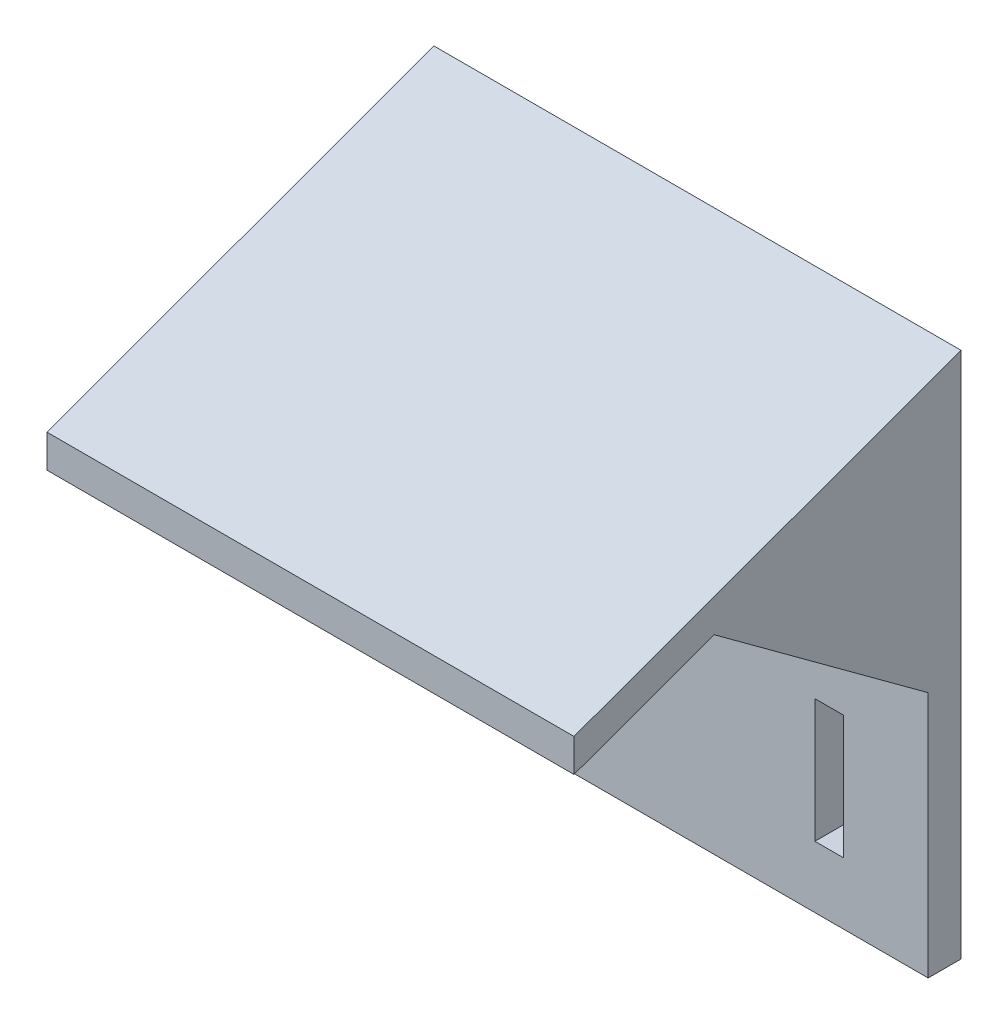
ISO-10303-21;
HEADER;
FILE_DESCRIPTION(('STEP AP214'),'2;1');
FILE_NAME('part.step','',(''),(''),'','','');
FILE_SCHEMA(('AUTOMOTIVE_DESIGN { 1 0 10303 214 1 1 1 1 }'));
ENDSEC;
DATA;
#1=APPLICATION_CONTEXT('core data for automotive mechanical design processes');
#2=APPLICATION_PROTOCOL_DEFINITION('international standard','automotive_design',2000,#1);
#3=PRODUCT_CONTEXT('',#1,'mechanical');
#4=PRODUCT('Part','Part','',(#3));
#5=PRODUCT_RELATED_PRODUCT_CATEGORY('part','',(#4));
#6=PRODUCT_DEFINITION_FORMATION('','',#4);
#7=PRODUCT_DEFINITION_CONTEXT('part definition',#1,'design');
#8=PRODUCT_DEFINITION('design','',#6,#7);
#9=PRODUCT_DEFINITION_SHAPE('','',#8);
#10=(LENGTH_UNIT() NAMED_UNIT(*) SI_UNIT(.MILLI.,.METRE.));
#11=(NAMED_UNIT(*) PLANE_ANGLE_UNIT() SI_UNIT($,.RADIAN.));
#12=(NAMED_UNIT(*) SI_UNIT($,.STERADIAN.) SOLID_ANGLE_UNIT());
#13=UNCERTAINTY_MEASURE_WITH_UNIT(LENGTH_MEASURE(1.E-05),#10,'distance_accuracy_value','');
#14=(GEOMETRIC_REPRESENTATION_CONTEXT(3) GLOBAL_UNCERTAINTY_ASSIGNED_CONTEXT((#13)) GLOBAL_UNIT_ASSIGNED_CONTEXT((#10,
#11,#12)) REPRESENTATION_CONTEXT('',''));
#15=CARTESIAN_POINT('',(0.,0.,0.));
#16=DIRECTION('',(0.,0.,1.));
#17=DIRECTION('',(1.,0.,0.));
#18=AXIS2_PLACEMENT_3D('',#15,#16,#17);
#19=CARTESIAN_POINT('',(32.,64.,0.));
#20=DIRECTION('',(0.,0.,1.));
#21=DIRECTION('',(1.,0.,0.));
#22=AXIS2_PLACEMENT_3D('',#19,#20,#21);
#23=PLANE('',#22);
#24=DIRECTION('',(1.,0.,0.));
#25=VECTOR('',#24,1.);
#26=CARTESIAN_POINT('',(-18.25,22.5,0.));
#27=LINE('',#26,#25);
#28=CARTESIAN_POINT('',(-21.75,22.5,0.));
#29=VERTEX_POINT('',#28);
#30=CARTESIAN_POINT('',(-18.25,22.5,0.));
#31=VERTEX_POINT('',#30);
#32=EDGE_CURVE('E159',#29,#31,#27,.T.);
#33=ORIENTED_EDGE('',*,*,#32,.F.);
#34=DIRECTION('',(0.,1.,0.));
#35=VECTOR('',#34,1.);
#36=CARTESIAN_POINT('',(-21.75,7.5,0.));
#37=LINE('',#36,#35);
#38=CARTESIAN_POINT('',(-21.75,7.5,0.));
#39=VERTEX_POINT('',#38);
#40=EDGE_CURVE('E50',#39,#29,#37,.T.);
#41=ORIENTED_EDGE('',*,*,#40,.F.);
#42=DIRECTION('',(-1.,0.,0.));
#43=VECTOR('',#42,1.);
#44=CARTESIAN_POINT('',(-18.25,7.5,0.));
#45=LINE('',#44,#43);
#46=CARTESIAN_POINT('',(-18.25,7.5,0.));
#47=VERTEX_POINT('',#46);
#48=EDGE_CURVE('E165',#47,#39,#45,.T.);
#49=ORIENTED_EDGE('',*,*,#48,.F.);
#50=DIRECTION('',(0.,-1.,0.));
#51=VECTOR('',#50,1.);
#52=CARTESIAN_POINT('',(-18.25,7.5,0.));
#53=LINE('',#52,#51);
#54=EDGE_CURVE('E149',#31,#47,#53,.T.);
#55=ORIENTED_EDGE('',*,*,#54,.F.);
#56=EDGE_LOOP('',(#33,#41,#49,#55));
#57=FACE_BOUND('',#56,.T.);
#58=DIRECTION('',(1.,0.,0.));
#59=VECTOR('',#58,1.);
#60=CARTESIAN_POINT('',(21.75,22.5,0.));
#61=LINE('',#60,#59);
#62=CARTESIAN_POINT('',(18.25,22.5,0.));
#63=VERTEX_POINT('',#62);
#64=CARTESIAN_POINT('',(21.75,22.5,0.));
#65=VERTEX_POINT('',#64);
#66=EDGE_CURVE('E189',#63,#65,#61,.T.);
#67=ORIENTED_EDGE('',*,*,#66,.F.);
#68=DIRECTION('',(0.,1.,0.));
#69=VECTOR('',#68,1.);
#70=CARTESIAN_POINT('',(18.25,7.5,0.));
#71=LINE('',#70,#69);
#72=CARTESIAN_POINT('',(18.25,7.5,0.));
#73=VERTEX_POINT('',#72);
#74=EDGE_CURVE('E58',#73,#63,#71,.T.);
#75=ORIENTED_EDGE('',*,*,#74,.F.);
#76=DIRECTION('',(-1.,0.,0.));
#77=VECTOR('',#76,1.);
#78=CARTESIAN_POINT('',(21.75,7.5,0.));
#79=LINE('',#78,#77);
#80=CARTESIAN_POINT('',(21.75,7.5,0.));
#81=VERTEX_POINT('',#80);
#82=EDGE_CURVE('E177',#81,#73,#79,.T.);
#83=ORIENTED_EDGE('',*,*,#82,.F.);
#84=DIRECTION('',(0.,-1.,0.));
#85=VECTOR('',#84,1.);
#86=CARTESIAN_POINT('',(21.75,7.5,0.));
#87=LINE('',#86,#85);
#88=EDGE_CURVE('E186',#65,#81,#87,.T.);
#89=ORIENTED_EDGE('',*,*,#88,.F.);
#90=EDGE_LOOP('',(#67,#75,#83,#89));
#91=FACE_BOUND('',#90,.T.);
#92=DIRECTION('',(0.,1.,0.));
#93=VECTOR('',#92,1.);
#94=CARTESIAN_POINT('',(-32.,64.,0.));
#95=LINE('',#94,#93);
#96=CARTESIAN_POINT('',(-32.,0.,0.));
#97=VERTEX_POINT('',#96);
#98=CARTESIAN_POINT('',(-32.,64.,0.));
#99=VERTEX_POINT('',#98);
#100=EDGE_CURVE('E172',#97,#99,#95,.T.);
#101=ORIENTED_EDGE('',*,*,#100,.T.);
#102=DIRECTION('',(-1.,0.,0.));
#103=VECTOR('',#102,1.);
#104=CARTESIAN_POINT('',(32.,64.,0.));
#105=LINE('',#104,#103);
#106=CARTESIAN_POINT('',(32.,64.,0.));
#107=VERTEX_POINT('',#106);
#108=EDGE_CURVE('E240',#107,#99,#105,.T.);
#109=ORIENTED_EDGE('',*,*,#108,.F.);
#110=DIRECTION('',(0.,1.,0.));
#111=VECTOR('',#110,1.);
#112=CARTESIAN_POINT('',(32.,64.,0.));
#113=LINE('',#112,#111);
#114=CARTESIAN_POINT('',(32.,0.,0.));
#115=VERTEX_POINT('',#114);
#116=EDGE_CURVE('E193',#115,#107,#113,.T.);
#117=ORIENTED_EDGE('',*,*,#116,.F.);
#118=DIRECTION('',(-1.,0.,0.));
#119=VECTOR('',#118,1.);
#120=CARTESIAN_POINT('',(32.,0.,0.));
#121=LINE('',#120,#119);
#122=EDGE_CURVE('E209',#115,#97,#121,.T.);
#123=ORIENTED_EDGE('',*,*,#122,.T.);
#124=EDGE_LOOP('',(#101,#109,#117,#123));
#125=FACE_BOUND('',#124,.T.);
#126=ADVANCED_FACE('F36',(#57,#91,#125),#23,.F.);
#127=CARTESIAN_POINT('',(32.,46.9,47.));
#128=DIRECTION('',(0.,-0.939735032076165,-0.341903596776648));
#129=DIRECTION('',(0.,0.341903596776648,-0.939735032076165));
#130=AXIS2_PLACEMENT_3D('',#127,#128,#129);
#131=PLANE('',#130);
#132=DIRECTION('',(0.,-0.341903596776648,0.939735032076165));
#133=VECTOR('',#132,1.);
#134=CARTESIAN_POINT('',(-32.,46.9,47.));
#135=LINE('',#134,#133);
#136=CARTESIAN_POINT('',(-32.,46.9,47.));
#137=VERTEX_POINT('',#136);
#138=EDGE_CURVE('E212',#99,#137,#135,.T.);
#139=ORIENTED_EDGE('',*,*,#138,.T.);
#140=DIRECTION('',(-1.,0.,0.));
#141=VECTOR('',#140,1.);
#142=CARTESIAN_POINT('',(32.,46.9,47.));
#143=LINE('',#142,#141);
#144=CARTESIAN_POINT('',(32.,46.9,47.));
#145=VERTEX_POINT('',#144);
#146=EDGE_CURVE('E237',#145,#137,#143,.T.);
#147=ORIENTED_EDGE('',*,*,#146,.F.);
#148=DIRECTION('',(0.,-0.341903596776648,0.939735032076165));
#149=VECTOR('',#148,1.);
#150=CARTESIAN_POINT('',(32.,46.9,47.));
#151=LINE('',#150,#149);
#152=EDGE_CURVE('E196',#107,#145,#151,.T.);
#153=ORIENTED_EDGE('',*,*,#152,.F.);
#154=ORIENTED_EDGE('',*,*,#108,.T.);
#155=EDGE_LOOP('',(#139,#147,#153,#154));
#156=FACE_BOUND('',#155,.T.);
#157=ADVANCED_FACE('F279',(#156),#131,.F.);
#158=CARTESIAN_POINT('',(32.,42.9,47.));
#159=DIRECTION('',(0.,0.,-1.));
#160=DIRECTION('',(-1.,0.,0.));
#161=AXIS2_PLACEMENT_3D('',#158,#159,#160);
#162=PLANE('',#161);
#163=DIRECTION('',(0.,-1.,0.));
#164=VECTOR('',#163,1.);
#165=CARTESIAN_POINT('',(-32.,42.9,47.));
#166=LINE('',#165,#164);
#167=CARTESIAN_POINT('',(-32.,42.9,47.));
#168=VERTEX_POINT('',#167);
#169=EDGE_CURVE('E214',#137,#168,#166,.T.);
#170=ORIENTED_EDGE('',*,*,#169,.T.);
#171=DIRECTION('',(-1.,0.,0.));
#172=VECTOR('',#171,1.);
#173=CARTESIAN_POINT('',(32.,42.9,47.));
#174=LINE('',#173,#172);
#175=CARTESIAN_POINT('',(32.,42.9,47.));
#176=VERTEX_POINT('',#175);
#177=EDGE_CURVE('E234',#176,#168,#174,.T.);
#178=ORIENTED_EDGE('',*,*,#177,.F.);
#179=DIRECTION('',(0.,-1.,0.));
#180=VECTOR('',#179,1.);
#181=CARTESIAN_POINT('',(32.,42.9,47.));
#182=LINE('',#181,#180);
#183=EDGE_CURVE('E199',#145,#176,#182,.T.);
#184=ORIENTED_EDGE('',*,*,#183,.F.);
#185=ORIENTED_EDGE('',*,*,#146,.T.);
#186=EDGE_LOOP('',(#170,#178,#184,#185));
#187=FACE_BOUND('',#186,.T.);
#188=ADVANCED_FACE('F283',(#187),#162,.F.);
#189=CARTESIAN_POINT('',(32.,49.1,30.));
#190=DIRECTION('',(0.,0.93947030108257,0.342630345100702));
#191=DIRECTION('',(0.,-0.342630345100702,0.93947030108257));
#192=AXIS2_PLACEMENT_3D('',#189,#190,#191);
#193=PLANE('',#192);
#194=DIRECTION('',(0.,0.342630345100702,-0.93947030108257));
#195=VECTOR('',#194,1.);
#196=CARTESIAN_POINT('',(-32.,49.1,30.));
#197=LINE('',#196,#195);
#198=CARTESIAN_POINT('',(-32.,49.1,30.));
#199=VERTEX_POINT('',#198);
#200=EDGE_CURVE('E216',#168,#199,#197,.T.);
#201=ORIENTED_EDGE('',*,*,#200,.T.);
#202=DIRECTION('',(-1.,0.,0.));
#203=VECTOR('',#202,1.);
#204=CARTESIAN_POINT('',(32.,49.1,30.));
#205=LINE('',#204,#203);
#206=CARTESIAN_POINT('',(32.,49.1,30.));
#207=VERTEX_POINT('',#206);
#208=EDGE_CURVE('E231',#207,#199,#205,.T.);
#209=ORIENTED_EDGE('',*,*,#208,.F.);
#210=DIRECTION('',(0.,0.342630345100702,-0.93947030108257));
#211=VECTOR('',#210,1.);
#212=CARTESIAN_POINT('',(32.,49.1,30.));
#213=LINE('',#212,#211);
#214=EDGE_CURVE('E201',#176,#207,#213,.T.);
#215=ORIENTED_EDGE('',*,*,#214,.F.);
#216=ORIENTED_EDGE('',*,*,#177,.T.);
#217=EDGE_LOOP('',(#201,#209,#215,#216));
#218=FACE_BOUND('',#217,.T.);
#219=ADVANCED_FACE('F288',(#218),#193,.F.);
#220=CARTESIAN_POINT('',(32.,30.,4.));
#221=DIRECTION('',(0.,0.805911995185586,-0.592035350309412));
#222=DIRECTION('',(0.,0.592035350309412,0.805911995185586));
#223=AXIS2_PLACEMENT_3D('',#220,#221,#222);
#224=PLANE('',#223);
#225=DIRECTION('',(0.,-0.592035350309412,-0.805911995185586));
#226=VECTOR('',#225,1.);
#227=CARTESIAN_POINT('',(-32.,30.,4.));
#228=LINE('',#227,#226);
#229=CARTESIAN_POINT('',(-32.,30.,4.));
#230=VERTEX_POINT('',#229);
#231=EDGE_CURVE('E218',#199,#230,#228,.T.);
#232=ORIENTED_EDGE('',*,*,#231,.T.);
#233=DIRECTION('',(-1.,0.,0.));
#234=VECTOR('',#233,1.);
#235=CARTESIAN_POINT('',(32.,30.,4.));
#236=LINE('',#235,#234);
#237=CARTESIAN_POINT('',(32.,30.,4.));
#238=VERTEX_POINT('',#237);
#239=EDGE_CURVE('E228',#238,#230,#236,.T.);
#240=ORIENTED_EDGE('',*,*,#239,.F.);
#241=DIRECTION('',(0.,-0.592035350309412,-0.805911995185586));
#242=VECTOR('',#241,1.);
#243=CARTESIAN_POINT('',(32.,30.,4.));
#244=LINE('',#243,#242);
#245=EDGE_CURVE('E203',#207,#238,#244,.T.);
#246=ORIENTED_EDGE('',*,*,#245,.F.);
#247=ORIENTED_EDGE('',*,*,#208,.T.);
#248=EDGE_LOOP('',(#232,#240,#246,#247));
#249=FACE_BOUND('',#248,.T.);
#250=ADVANCED_FACE('F294',(#249),#224,.F.);
#251=CARTESIAN_POINT('',(32.,0.,4.));
#252=DIRECTION('',(0.,0.,-1.));
#253=DIRECTION('',(-1.,0.,0.));
#254=AXIS2_PLACEMENT_3D('',#251,#252,#253);
#255=PLANE('',#254);
#256=DIRECTION('',(-1.,0.,0.));
#257=VECTOR('',#256,1.);
#258=CARTESIAN_POINT('',(32.,7.5,4.));
#259=LINE('',#258,#257);
#260=CARTESIAN_POINT('',(-18.25,7.5,4.));
#261=VERTEX_POINT('',#260);
#262=CARTESIAN_POINT('',(-21.75,7.5,4.));
#263=VERTEX_POINT('',#262);
#264=EDGE_CURVE('E43',#261,#263,#259,.T.);
#265=ORIENTED_EDGE('',*,*,#264,.T.);
#266=DIRECTION('',(0.,1.,0.));
#267=VECTOR('',#266,1.);
#268=CARTESIAN_POINT('',(-21.75,0.,4.));
#269=LINE('',#268,#267);
#270=CARTESIAN_POINT('',(-21.75,22.5,4.));
#271=VERTEX_POINT('',#270);
#272=EDGE_CURVE('E11',#263,#271,#269,.T.);
#273=ORIENTED_EDGE('',*,*,#272,.T.);
#274=DIRECTION('',(1.,0.,0.));
#275=VECTOR('',#274,1.);
#276=CARTESIAN_POINT('',(32.,22.5,4.));
#277=LINE('',#276,#275);
#278=CARTESIAN_POINT('',(-18.25,22.5,4.));
#279=VERTEX_POINT('',#278);
#280=EDGE_CURVE('E255',#271,#279,#277,.T.);
#281=ORIENTED_EDGE('',*,*,#280,.T.);
#282=DIRECTION('',(0.,-1.,0.));
#283=VECTOR('',#282,1.);
#284=CARTESIAN_POINT('',(-18.25,0.,4.));
#285=LINE('',#284,#283);
#286=EDGE_CURVE('E152',#279,#261,#285,.T.);
#287=ORIENTED_EDGE('',*,*,#286,.T.);
#288=EDGE_LOOP('',(#265,#273,#281,#287));
#289=FACE_BOUND('',#288,.T.);
#290=DIRECTION('',(-1.,0.,0.));
#291=VECTOR('',#290,1.);
#292=CARTESIAN_POINT('',(32.,7.5,4.));
#293=LINE('',#292,#291);
#294=CARTESIAN_POINT('',(21.75,7.5,4.));
#295=VERTEX_POINT('',#294);
#296=CARTESIAN_POINT('',(18.25,7.5,4.));
#297=VERTEX_POINT('',#296);
#298=EDGE_CURVE('E249',#295,#297,#293,.T.);
#299=ORIENTED_EDGE('',*,*,#298,.T.);
#300=DIRECTION('',(0.,1.,0.));
#301=VECTOR('',#300,1.);
#302=CARTESIAN_POINT('',(18.25,0.,4.));
#303=LINE('',#302,#301);
#304=CARTESIAN_POINT('',(18.25,22.5,4.));
#305=VERTEX_POINT('',#304);
#306=EDGE_CURVE('E252',#297,#305,#303,.T.);
#307=ORIENTED_EDGE('',*,*,#306,.T.);
#308=DIRECTION('',(1.,0.,0.));
#309=VECTOR('',#308,1.);
#310=CARTESIAN_POINT('',(32.,22.5,4.));
#311=LINE('',#310,#309);
#312=CARTESIAN_POINT('',(21.75,22.5,4.));
#313=VERTEX_POINT('',#312);
#314=EDGE_CURVE('E243',#305,#313,#311,.T.);
#315=ORIENTED_EDGE('',*,*,#314,.T.);
#316=DIRECTION('',(0.,-1.,0.));
#317=VECTOR('',#316,1.);
#318=CARTESIAN_POINT('',(21.75,0.,4.));
#319=LINE('',#318,#317);
#320=EDGE_CURVE('E246',#313,#295,#319,.T.);
#321=ORIENTED_EDGE('',*,*,#320,.T.);
#322=EDGE_LOOP('',(#299,#307,#315,#321));
#323=FACE_BOUND('',#322,.T.);
#324=DIRECTION('',(0.,-1.,0.));
#325=VECTOR('',#324,1.);
#326=CARTESIAN_POINT('',(-32.,0.,4.));
#327=LINE('',#326,#325);
#328=CARTESIAN_POINT('',(-32.,0.,4.));
#329=VERTEX_POINT('',#328);
#330=EDGE_CURVE('E220',#230,#329,#327,.T.);
#331=ORIENTED_EDGE('',*,*,#330,.T.);
#332=DIRECTION('',(-1.,0.,0.));
#333=VECTOR('',#332,1.);
#334=CARTESIAN_POINT('',(32.,0.,4.));
#335=LINE('',#334,#333);
#336=CARTESIAN_POINT('',(32.,0.,4.));
#337=VERTEX_POINT('',#336);
#338=EDGE_CURVE('E225',#337,#329,#335,.T.);
#339=ORIENTED_EDGE('',*,*,#338,.F.);
#340=DIRECTION('',(0.,-1.,0.));
#341=VECTOR('',#340,1.);
#342=CARTESIAN_POINT('',(32.,0.,4.));
#343=LINE('',#342,#341);
#344=EDGE_CURVE('E205',#238,#337,#343,.T.);
#345=ORIENTED_EDGE('',*,*,#344,.F.);
#346=ORIENTED_EDGE('',*,*,#239,.T.);
#347=EDGE_LOOP('',(#331,#339,#345,#346));
#348=FACE_BOUND('',#347,.T.);
#349=ADVANCED_FACE('F259',(#289,#323,#348),#255,.F.);
#350=CARTESIAN_POINT('',(32.,0.,0.));
#351=DIRECTION('',(0.,1.,0.));
#352=DIRECTION('',(0.,0.,1.));
#353=AXIS2_PLACEMENT_3D('',#350,#351,#352);
#354=PLANE('',#353);
#355=DIRECTION('',(0.,0.,-1.));
#356=VECTOR('',#355,1.);
#357=CARTESIAN_POINT('',(-32.,0.,0.));
#358=LINE('',#357,#356);
#359=EDGE_CURVE('E197',#329,#97,#358,.T.);
#360=ORIENTED_EDGE('',*,*,#359,.T.);
#361=ORIENTED_EDGE('',*,*,#122,.F.);
#362=DIRECTION('',(0.,0.,-1.));
#363=VECTOR('',#362,1.);
#364=CARTESIAN_POINT('',(32.,0.,0.));
#365=LINE('',#364,#363);
#366=EDGE_CURVE('E207',#337,#115,#365,.T.);
#367=ORIENTED_EDGE('',*,*,#366,.F.);
#368=ORIENTED_EDGE('',*,*,#338,.T.);
#369=EDGE_LOOP('',(#360,#361,#367,#368));
#370=FACE_BOUND('',#369,.T.);
#371=ADVANCED_FACE('F301',(#370),#354,.F.);
#372=CARTESIAN_POINT('',(32.,0.,0.));
#373=DIRECTION('',(-1.,0.,0.));
#374=DIRECTION('',(0.,0.,1.));
#375=AXIS2_PLACEMENT_3D('',#372,#373,#374);
#376=PLANE('',#375);
#377=ORIENTED_EDGE('',*,*,#116,.T.);
#378=ORIENTED_EDGE('',*,*,#152,.T.);
#379=ORIENTED_EDGE('',*,*,#183,.T.);
#380=ORIENTED_EDGE('',*,*,#214,.T.);
#381=ORIENTED_EDGE('',*,*,#245,.T.);
#382=ORIENTED_EDGE('',*,*,#344,.T.);
#383=ORIENTED_EDGE('',*,*,#366,.T.);
#384=EDGE_LOOP('',(#377,#378,#379,#380,#381,#382,#383));
#385=FACE_BOUND('',#384,.T.);
#386=ADVANCED_FACE('F304',(#385),#376,.F.);
#387=CARTESIAN_POINT('',(-32.,0.,0.));
#388=DIRECTION('',(-1.,0.,0.));
#389=DIRECTION('',(0.,0.,1.));
#390=AXIS2_PLACEMENT_3D('',#387,#388,#389);
#391=PLANE('',#390);
#392=ORIENTED_EDGE('',*,*,#100,.F.);
#393=ORIENTED_EDGE('',*,*,#359,.F.);
#394=ORIENTED_EDGE('',*,*,#330,.F.);
#395=ORIENTED_EDGE('',*,*,#231,.F.);
#396=ORIENTED_EDGE('',*,*,#200,.F.);
#397=ORIENTED_EDGE('',*,*,#169,.F.);
#398=ORIENTED_EDGE('',*,*,#138,.F.);
#399=EDGE_LOOP('',(#392,#393,#394,#395,#396,#397,#398));
#400=FACE_BOUND('',#399,.T.);
#401=ADVANCED_FACE('F306',(#400),#391,.T.);
#402=CARTESIAN_POINT('',(18.25,7.5,47.));
#403=DIRECTION('',(-1.,0.,0.));
#404=DIRECTION('',(0.,0.,1.));
#405=AXIS2_PLACEMENT_3D('',#402,#403,#404);
#406=PLANE('',#405);
#407=DIRECTION('',(0.,0.,-1.));
#408=VECTOR('',#407,1.);
#409=CARTESIAN_POINT('',(18.25,7.5,47.));
#410=LINE('',#409,#408);
#411=EDGE_CURVE('E182',#297,#73,#410,.T.);
#412=ORIENTED_EDGE('',*,*,#411,.T.);
#413=ORIENTED_EDGE('',*,*,#74,.T.);
#414=DIRECTION('',(0.,0.,-1.));
#415=VECTOR('',#414,1.);
#416=CARTESIAN_POINT('',(18.25,22.5,47.));
#417=LINE('',#416,#415);
#418=EDGE_CURVE('E175',#305,#63,#417,.T.);
#419=ORIENTED_EDGE('',*,*,#418,.F.);
#420=ORIENTED_EDGE('',*,*,#306,.F.);
#421=EDGE_LOOP('',(#412,#413,#419,#420));
#422=FACE_BOUND('',#421,.T.);
#423=ADVANCED_FACE('F309',(#422),#406,.F.);
#424=CARTESIAN_POINT('',(21.75,7.5,47.));
#425=DIRECTION('',(0.,-1.,0.));
#426=DIRECTION('',(0.,0.,-1.));
#427=AXIS2_PLACEMENT_3D('',#424,#425,#426);
#428=PLANE('',#427);
#429=DIRECTION('',(0.,0.,-1.));
#430=VECTOR('',#429,1.);
#431=CARTESIAN_POINT('',(21.75,7.5,47.));
#432=LINE('',#431,#430);
#433=EDGE_CURVE('E180',#295,#81,#432,.T.);
#434=ORIENTED_EDGE('',*,*,#433,.T.);
#435=ORIENTED_EDGE('',*,*,#82,.T.);
#436=ORIENTED_EDGE('',*,*,#411,.F.);
#437=ORIENTED_EDGE('',*,*,#298,.F.);
#438=EDGE_LOOP('',(#434,#435,#436,#437));
#439=FACE_BOUND('',#438,.T.);
#440=ADVANCED_FACE('F314',(#439),#428,.F.);
#441=CARTESIAN_POINT('',(21.75,7.5,47.));
#442=DIRECTION('',(1.,0.,0.));
#443=DIRECTION('',(0.,0.,-1.));
#444=AXIS2_PLACEMENT_3D('',#441,#442,#443);
#445=PLANE('',#444);
#446=DIRECTION('',(0.,0.,-1.));
#447=VECTOR('',#446,1.);
#448=CARTESIAN_POINT('',(21.75,22.5,47.));
#449=LINE('',#448,#447);
#450=EDGE_CURVE('E178',#313,#65,#449,.T.);
#451=ORIENTED_EDGE('',*,*,#450,.T.);
#452=ORIENTED_EDGE('',*,*,#88,.T.);
#453=ORIENTED_EDGE('',*,*,#433,.F.);
#454=ORIENTED_EDGE('',*,*,#320,.F.);
#455=EDGE_LOOP('',(#451,#452,#453,#454));
#456=FACE_BOUND('',#455,.T.);
#457=ADVANCED_FACE('F273',(#456),#445,.F.);
#458=CARTESIAN_POINT('',(21.75,22.5,47.));
#459=DIRECTION('',(0.,1.,0.));
#460=DIRECTION('',(0.,0.,1.));
#461=AXIS2_PLACEMENT_3D('',#458,#459,#460);
#462=PLANE('',#461);
#463=ORIENTED_EDGE('',*,*,#418,.T.);
#464=ORIENTED_EDGE('',*,*,#66,.T.);
#465=ORIENTED_EDGE('',*,*,#450,.F.);
#466=ORIENTED_EDGE('',*,*,#314,.F.);
#467=EDGE_LOOP('',(#463,#464,#465,#466));
#468=FACE_BOUND('',#467,.T.);
#469=ADVANCED_FACE('F266',(#468),#462,.F.);
#470=CARTESIAN_POINT('',(-21.75,7.5,47.));
#471=DIRECTION('',(-1.,0.,0.));
#472=DIRECTION('',(0.,0.,1.));
#473=AXIS2_PLACEMENT_3D('',#470,#471,#472);
#474=PLANE('',#473);
#475=DIRECTION('',(0.,0.,-1.));
#476=VECTOR('',#475,1.);
#477=CARTESIAN_POINT('',(-21.75,7.5,47.));
#478=LINE('',#477,#476);
#479=EDGE_CURVE('E170',#263,#39,#478,.T.);
#480=ORIENTED_EDGE('',*,*,#479,.T.);
#481=ORIENTED_EDGE('',*,*,#40,.T.);
#482=DIRECTION('',(0.,0.,-1.));
#483=VECTOR('',#482,1.);
#484=CARTESIAN_POINT('',(-21.75,22.5,47.));
#485=LINE('',#484,#483);
#486=EDGE_CURVE('E156',#271,#29,#485,.T.);
#487=ORIENTED_EDGE('',*,*,#486,.F.);
#488=ORIENTED_EDGE('',*,*,#272,.F.);
#489=EDGE_LOOP('',(#480,#481,#487,#488));
#490=FACE_BOUND('',#489,.T.);
#491=ADVANCED_FACE('F264',(#490),#474,.F.);
#492=CARTESIAN_POINT('',(-18.25,7.5,47.));
#493=DIRECTION('',(0.,-1.,0.));
#494=DIRECTION('',(0.,0.,-1.));
#495=AXIS2_PLACEMENT_3D('',#492,#493,#494);
#496=PLANE('',#495);
#497=DIRECTION('',(0.,0.,-1.));
#498=VECTOR('',#497,1.);
#499=CARTESIAN_POINT('',(-18.25,7.5,47.));
#500=LINE('',#499,#498);
#501=EDGE_CURVE('E155',#261,#47,#500,.T.);
#502=ORIENTED_EDGE('',*,*,#501,.T.);
#503=ORIENTED_EDGE('',*,*,#48,.T.);
#504=ORIENTED_EDGE('',*,*,#479,.F.);
#505=ORIENTED_EDGE('',*,*,#264,.F.);
#506=EDGE_LOOP('',(#502,#503,#504,#505));
#507=FACE_BOUND('',#506,.T.);
#508=ADVANCED_FACE('F263',(#507),#496,.F.);
#509=CARTESIAN_POINT('',(-18.25,7.5,47.));
#510=DIRECTION('',(1.,0.,0.));
#511=DIRECTION('',(0.,0.,-1.));
#512=AXIS2_PLACEMENT_3D('',#509,#510,#511);
#513=PLANE('',#512);
#514=DIRECTION('',(0.,0.,-1.));
#515=VECTOR('',#514,1.);
#516=CARTESIAN_POINT('',(-18.25,22.5,47.));
#517=LINE('',#516,#515);
#518=EDGE_CURVE('E144',#279,#31,#517,.T.);
#519=ORIENTED_EDGE('',*,*,#518,.T.);
#520=ORIENTED_EDGE('',*,*,#54,.T.);
#521=ORIENTED_EDGE('',*,*,#501,.F.);
#522=ORIENTED_EDGE('',*,*,#286,.F.);
#523=EDGE_LOOP('',(#519,#520,#521,#522));
#524=FACE_BOUND('',#523,.T.);
#525=ADVANCED_FACE('F146',(#524),#513,.F.);
#526=CARTESIAN_POINT('',(-18.25,22.5,47.));
#527=DIRECTION('',(0.,1.,0.));
#528=DIRECTION('',(0.,0.,1.));
#529=AXIS2_PLACEMENT_3D('',#526,#527,#528);
#530=PLANE('',#529);
#531=ORIENTED_EDGE('',*,*,#486,.T.);
#532=ORIENTED_EDGE('',*,*,#32,.T.);
#533=ORIENTED_EDGE('',*,*,#518,.F.);
#534=ORIENTED_EDGE('',*,*,#280,.F.);
#535=EDGE_LOOP('',(#531,#532,#533,#534));
#536=FACE_BOUND('',#535,.T.);
#537=ADVANCED_FACE('F160',(#536),#530,.F.);
#538=CLOSED_SHELL('',(#126,#157,#188,#219,#250,#349,#371,#386,#401,#423,#440,#457,#469,#491,
#508,#525,#537));
#539=MANIFOLD_SOLID_BREP('B2',#538);
#540=ADVANCED_BREP_SHAPE_REPRESENTATION('',(#18,#539),#14);
#541=SHAPE_DEFINITION_REPRESENTATION(#9,#540);
ENDSEC;
END-ISO-10303-21;
